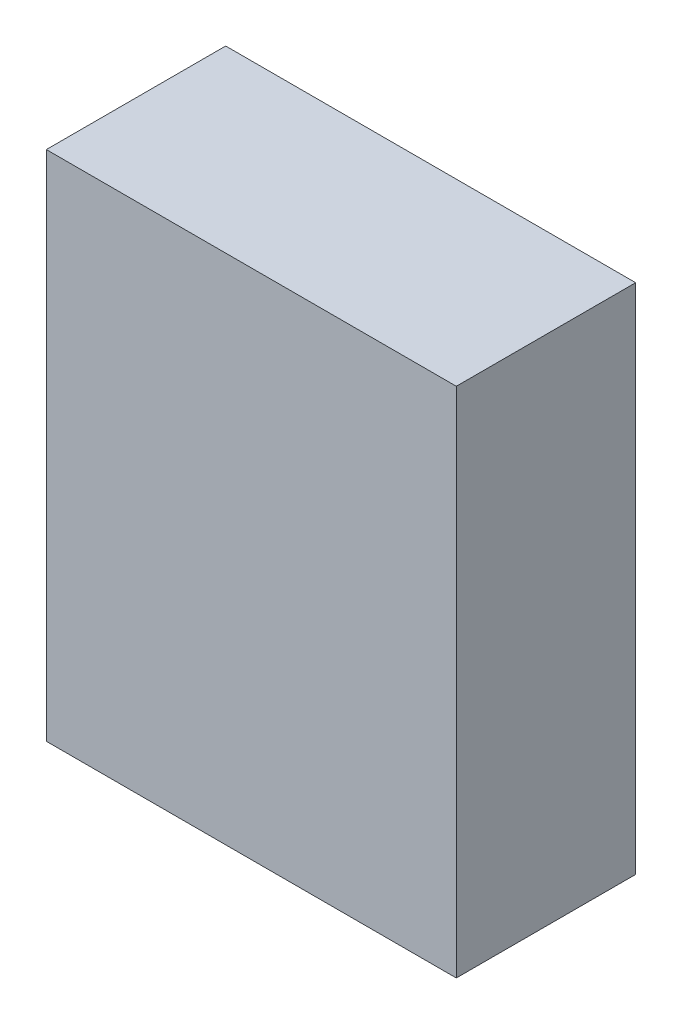
ISO-10303-21;
HEADER;
FILE_DESCRIPTION(('STEP AP214'),'2;1');
FILE_NAME('part.step','',(''),(''),'','','');
FILE_SCHEMA(('AUTOMOTIVE_DESIGN { 1 0 10303 214 1 1 1 1 }'));
ENDSEC;
DATA;
#1=APPLICATION_CONTEXT('core data for automotive mechanical design processes');
#2=APPLICATION_PROTOCOL_DEFINITION('international standard','automotive_design',2000,#1);
#3=PRODUCT_CONTEXT('',#1,'mechanical');
#4=PRODUCT('Part','Part','',(#3));
#5=PRODUCT_RELATED_PRODUCT_CATEGORY('part','',(#4));
#6=PRODUCT_DEFINITION_FORMATION('','',#4);
#7=PRODUCT_DEFINITION_CONTEXT('part definition',#1,'design');
#8=PRODUCT_DEFINITION('design','',#6,#7);
#9=PRODUCT_DEFINITION_SHAPE('','',#8);
#10=(LENGTH_UNIT() NAMED_UNIT(*) SI_UNIT(.MILLI.,.METRE.));
#11=(NAMED_UNIT(*) PLANE_ANGLE_UNIT() SI_UNIT($,.RADIAN.));
#12=(NAMED_UNIT(*) SI_UNIT($,.STERADIAN.) SOLID_ANGLE_UNIT());
#13=UNCERTAINTY_MEASURE_WITH_UNIT(LENGTH_MEASURE(1.E-05),#10,'distance_accuracy_value','');
#14=(GEOMETRIC_REPRESENTATION_CONTEXT(3) GLOBAL_UNCERTAINTY_ASSIGNED_CONTEXT((#13)) GLOBAL_UNIT_ASSIGNED_CONTEXT((#10,
#11,#12)) REPRESENTATION_CONTEXT('',''));
#15=CARTESIAN_POINT('',(0.,0.,0.));
#16=DIRECTION('',(0.,0.,1.));
#17=DIRECTION('',(1.,0.,0.));
#18=AXIS2_PLACEMENT_3D('',#15,#16,#17);
#19=CARTESIAN_POINT('',(0.7999984,-1.00000054,0.70000114));
#20=DIRECTION('',(0.,0.,-1.));
#21=DIRECTION('',(-1.,0.,0.));
#22=AXIS2_PLACEMENT_3D('',#19,#20,#21);
#23=PLANE('',#22);
#24=DIRECTION('',(1.,0.,0.));
#25=VECTOR('',#24,1.);
#26=CARTESIAN_POINT('',(0.7999984,1.00000054,0.70000114));
#27=LINE('',#26,#25);
#28=CARTESIAN_POINT('',(0.7999984,1.00000054,0.70000114));
#29=VERTEX_POINT('',#28);
#30=CARTESIAN_POINT('',(-0.7999984,1.00000054,0.70000114));
#31=VERTEX_POINT('',#30);
#32=EDGE_CURVE('E55',#29,#31,#27,.F.);
#33=ORIENTED_EDGE('',*,*,#32,.T.);
#34=DIRECTION('',(0.,1.,0.));
#35=VECTOR('',#34,1.);
#36=CARTESIAN_POINT('',(-0.7999984,1.00000054,0.70000114));
#37=LINE('',#36,#35);
#38=CARTESIAN_POINT('',(-0.7999984,-1.00000054,0.70000114));
#39=VERTEX_POINT('',#38);
#40=EDGE_CURVE('E57',#31,#39,#37,.F.);
#41=ORIENTED_EDGE('',*,*,#40,.T.);
#42=DIRECTION('',(1.,0.,0.));
#43=VECTOR('',#42,1.);
#44=CARTESIAN_POINT('',(-0.7999984,-1.00000054,0.70000114));
#45=LINE('',#44,#43);
#46=CARTESIAN_POINT('',(0.7999984,-1.00000054,0.70000114));
#47=VERTEX_POINT('',#46);
#48=EDGE_CURVE('E20',#39,#47,#45,.T.);
#49=ORIENTED_EDGE('',*,*,#48,.T.);
#50=DIRECTION('',(0.,1.,0.));
#51=VECTOR('',#50,1.);
#52=CARTESIAN_POINT('',(0.7999984,-1.00000054,0.70000114));
#53=LINE('',#52,#51);
#54=EDGE_CURVE('E80',#47,#29,#53,.T.);
#55=ORIENTED_EDGE('',*,*,#54,.T.);
#56=EDGE_LOOP('',(#33,#41,#49,#55));
#57=FACE_BOUND('',#56,.T.);
#58=ADVANCED_FACE('F17',(#57),#23,.F.);
#59=CARTESIAN_POINT('',(-0.7999984,-1.00000054,0.));
#60=DIRECTION('',(0.,1.,0.));
#61=DIRECTION('',(0.,0.,1.));
#62=AXIS2_PLACEMENT_3D('',#59,#60,#61);
#63=PLANE('',#62);
#64=DIRECTION('',(0.,0.,1.));
#65=VECTOR('',#64,1.);
#66=CARTESIAN_POINT('',(0.7999984,-1.00000054,0.));
#67=LINE('',#66,#65);
#68=CARTESIAN_POINT('',(0.7999984,-1.00000054,0.));
#69=VERTEX_POINT('',#68);
#70=EDGE_CURVE('E68',#69,#47,#67,.T.);
#71=ORIENTED_EDGE('',*,*,#70,.T.);
#72=ORIENTED_EDGE('',*,*,#48,.F.);
#73=DIRECTION('',(0.,0.,-1.));
#74=VECTOR('',#73,1.);
#75=CARTESIAN_POINT('',(-0.7999984,-1.00000054,0.));
#76=LINE('',#75,#74);
#77=CARTESIAN_POINT('',(-0.7999984,-1.00000054,0.));
#78=VERTEX_POINT('',#77);
#79=EDGE_CURVE('E63',#39,#78,#76,.T.);
#80=ORIENTED_EDGE('',*,*,#79,.T.);
#81=DIRECTION('',(-1.,0.,0.));
#82=VECTOR('',#81,1.);
#83=CARTESIAN_POINT('',(0.7999984,-1.00000054,0.));
#84=LINE('',#83,#82);
#85=EDGE_CURVE('E83',#69,#78,#84,.T.);
#86=ORIENTED_EDGE('',*,*,#85,.F.);
#87=EDGE_LOOP('',(#71,#72,#80,#86));
#88=FACE_BOUND('',#87,.T.);
#89=ADVANCED_FACE('F65',(#88),#63,.F.);
#90=CARTESIAN_POINT('',(-0.7999984,1.00000054,0.));
#91=DIRECTION('',(1.,0.,0.));
#92=DIRECTION('',(0.,0.,-1.));
#93=AXIS2_PLACEMENT_3D('',#90,#91,#92);
#94=PLANE('',#93);
#95=ORIENTED_EDGE('',*,*,#79,.F.);
#96=ORIENTED_EDGE('',*,*,#40,.F.);
#97=DIRECTION('',(0.,0.,-1.));
#98=VECTOR('',#97,1.);
#99=CARTESIAN_POINT('',(-0.7999984,1.00000054,0.));
#100=LINE('',#99,#98);
#101=CARTESIAN_POINT('',(-0.7999984,1.00000054,0.));
#102=VERTEX_POINT('',#101);
#103=EDGE_CURVE('E75',#31,#102,#100,.T.);
#104=ORIENTED_EDGE('',*,*,#103,.T.);
#105=DIRECTION('',(0.,1.,0.));
#106=VECTOR('',#105,1.);
#107=CARTESIAN_POINT('',(-0.7999984,-1.00000054,0.));
#108=LINE('',#107,#106);
#109=EDGE_CURVE('E72',#78,#102,#108,.T.);
#110=ORIENTED_EDGE('',*,*,#109,.F.);
#111=EDGE_LOOP('',(#95,#96,#104,#110));
#112=FACE_BOUND('',#111,.T.);
#113=ADVANCED_FACE('F70',(#112),#94,.F.);
#114=CARTESIAN_POINT('',(0.7999984,1.00000054,0.));
#115=DIRECTION('',(0.,-1.,0.));
#116=DIRECTION('',(0.,0.,-1.));
#117=AXIS2_PLACEMENT_3D('',#114,#115,#116);
#118=PLANE('',#117);
#119=ORIENTED_EDGE('',*,*,#103,.F.);
#120=ORIENTED_EDGE('',*,*,#32,.F.);
#121=DIRECTION('',(0.,0.,1.));
#122=VECTOR('',#121,1.);
#123=CARTESIAN_POINT('',(0.7999984,1.00000054,0.));
#124=LINE('',#123,#122);
#125=CARTESIAN_POINT('',(0.7999984,1.00000054,0.));
#126=VERTEX_POINT('',#125);
#127=EDGE_CURVE('E35',#29,#126,#124,.F.);
#128=ORIENTED_EDGE('',*,*,#127,.T.);
#129=DIRECTION('',(-1.,0.,0.));
#130=VECTOR('',#129,1.);
#131=CARTESIAN_POINT('',(0.7999984,1.00000054,0.));
#132=LINE('',#131,#130);
#133=EDGE_CURVE('E26',#102,#126,#132,.F.);
#134=ORIENTED_EDGE('',*,*,#133,.F.);
#135=EDGE_LOOP('',(#119,#120,#128,#134));
#136=FACE_BOUND('',#135,.T.);
#137=ADVANCED_FACE('F89',(#136),#118,.F.);
#138=CARTESIAN_POINT('',(0.7999984,-1.00000054,0.));
#139=DIRECTION('',(-1.,0.,0.));
#140=DIRECTION('',(0.,0.,1.));
#141=AXIS2_PLACEMENT_3D('',#138,#139,#140);
#142=PLANE('',#141);
#143=ORIENTED_EDGE('',*,*,#127,.F.);
#144=ORIENTED_EDGE('',*,*,#54,.F.);
#145=ORIENTED_EDGE('',*,*,#70,.F.);
#146=DIRECTION('',(0.,1.,0.));
#147=VECTOR('',#146,1.);
#148=CARTESIAN_POINT('',(0.7999984,-1.00000054,0.));
#149=LINE('',#148,#147);
#150=EDGE_CURVE('E11',#126,#69,#149,.F.);
#151=ORIENTED_EDGE('',*,*,#150,.F.);
#152=EDGE_LOOP('',(#143,#144,#145,#151));
#153=FACE_BOUND('',#152,.T.);
#154=ADVANCED_FACE('F91',(#153),#142,.F.);
#155=CARTESIAN_POINT('',(0.7999984,-1.00000054,0.));
#156=DIRECTION('',(0.,0.,-1.));
#157=DIRECTION('',(-1.,0.,0.));
#158=AXIS2_PLACEMENT_3D('',#155,#156,#157);
#159=PLANE('',#158);
#160=ORIENTED_EDGE('',*,*,#133,.T.);
#161=ORIENTED_EDGE('',*,*,#150,.T.);
#162=ORIENTED_EDGE('',*,*,#85,.T.);
#163=ORIENTED_EDGE('',*,*,#109,.T.);
#164=EDGE_LOOP('',(#160,#161,#162,#163));
#165=FACE_BOUND('',#164,.T.);
#166=ADVANCED_FACE('F88',(#165),#159,.T.);
#167=CLOSED_SHELL('',(#58,#89,#113,#137,#154,#166));
#168=MANIFOLD_SOLID_BREP('B1',#167);
#169=ADVANCED_BREP_SHAPE_REPRESENTATION('',(#18,#168),#14);
#170=SHAPE_DEFINITION_REPRESENTATION(#9,#169);
ENDSEC;
END-ISO-10303-21;
